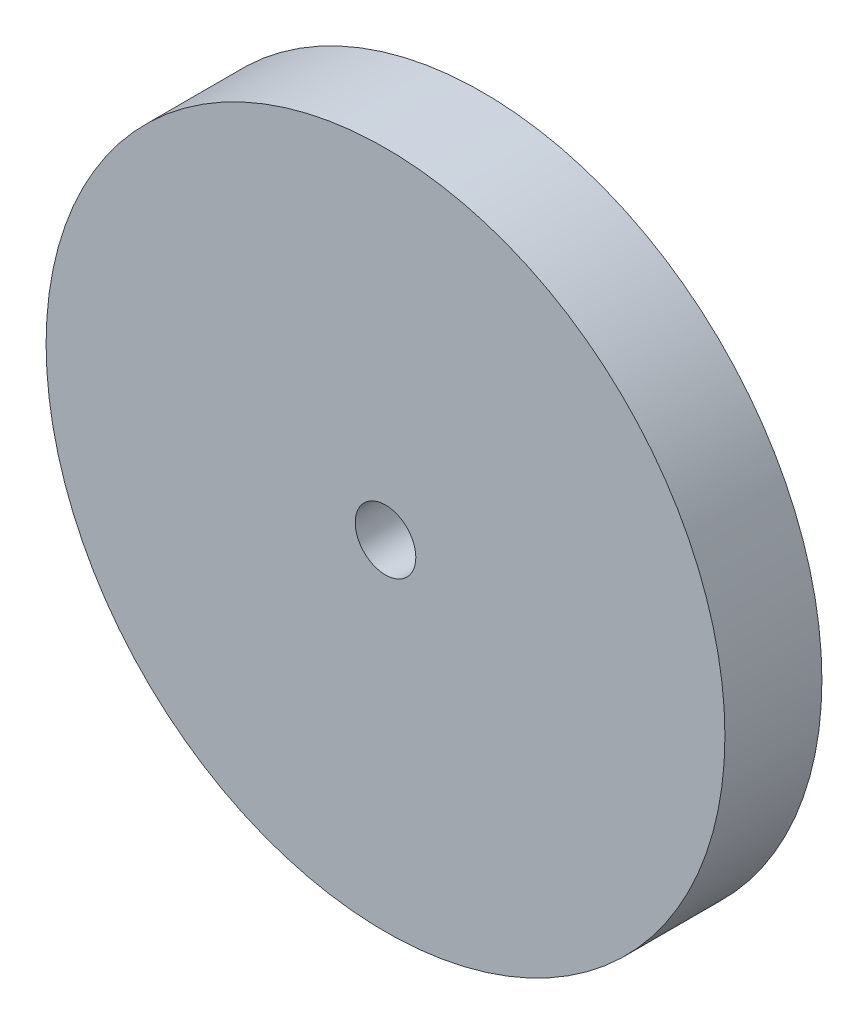
ISO-10303-21;
HEADER;
FILE_DESCRIPTION(('STEP AP214'),'2;1');
FILE_NAME('part.step','',(''),(''),'','','');
FILE_SCHEMA(('AUTOMOTIVE_DESIGN { 1 0 10303 214 1 1 1 1 }'));
ENDSEC;
DATA;
#1=APPLICATION_CONTEXT('core data for automotive mechanical design processes');
#2=APPLICATION_PROTOCOL_DEFINITION('international standard','automotive_design',2000,#1);
#3=PRODUCT_CONTEXT('',#1,'mechanical');
#4=PRODUCT('Part','Part','',(#3));
#5=PRODUCT_RELATED_PRODUCT_CATEGORY('part','',(#4));
#6=PRODUCT_DEFINITION_FORMATION('','',#4);
#7=PRODUCT_DEFINITION_CONTEXT('part definition',#1,'design');
#8=PRODUCT_DEFINITION('design','',#6,#7);
#9=PRODUCT_DEFINITION_SHAPE('','',#8);
#10=(LENGTH_UNIT() NAMED_UNIT(*) SI_UNIT(.MILLI.,.METRE.));
#11=(NAMED_UNIT(*) PLANE_ANGLE_UNIT() SI_UNIT($,.RADIAN.));
#12=(NAMED_UNIT(*) SI_UNIT($,.STERADIAN.) SOLID_ANGLE_UNIT());
#13=UNCERTAINTY_MEASURE_WITH_UNIT(LENGTH_MEASURE(1.E-05),#10,'distance_accuracy_value','');
#14=(GEOMETRIC_REPRESENTATION_CONTEXT(3) GLOBAL_UNCERTAINTY_ASSIGNED_CONTEXT((#13)) GLOBAL_UNIT_ASSIGNED_CONTEXT((#10,
#11,#12)) REPRESENTATION_CONTEXT('',''));
#15=CARTESIAN_POINT('',(0.,0.,0.));
#16=DIRECTION('',(0.,0.,1.));
#17=DIRECTION('',(1.,0.,0.));
#18=AXIS2_PLACEMENT_3D('',#15,#16,#17);
#19=CARTESIAN_POINT('',(0.,0.,40.));
#20=DIRECTION('',(0.,0.,1.));
#21=DIRECTION('',(1.,0.,0.));
#22=AXIS2_PLACEMENT_3D('',#19,#20,#21);
#23=PLANE('',#22);
#24=CARTESIAN_POINT('',(0.,0.,40.));
#25=DIRECTION('',(0.,0.,1.));
#26=DIRECTION('',(1.,0.,0.));
#27=AXIS2_PLACEMENT_3D('',#24,#25,#26);
#28=CIRCLE('',#27,140.);
#29=CARTESIAN_POINT('',(140.,0.,40.));
#30=VERTEX_POINT('',#29);
#31=EDGE_CURVE('E10',#30,#30,#28,.T.);
#32=ORIENTED_EDGE('',*,*,#31,.T.);
#33=EDGE_LOOP('',(#32));
#34=FACE_BOUND('',#33,.T.);
#35=CARTESIAN_POINT('',(0.,0.,40.));
#36=DIRECTION('',(0.,0.,1.));
#37=DIRECTION('',(1.,0.,0.));
#38=AXIS2_PLACEMENT_3D('',#35,#36,#37);
#39=CIRCLE('',#38,12.5);
#40=CARTESIAN_POINT('',(12.5,0.,40.));
#41=VERTEX_POINT('',#40);
#42=EDGE_CURVE('E56',#41,#41,#39,.T.);
#43=ORIENTED_EDGE('',*,*,#42,.F.);
#44=EDGE_LOOP('',(#43));
#45=FACE_BOUND('',#44,.T.);
#46=ADVANCED_FACE('F43',(#34,#45),#23,.T.);
#47=CARTESIAN_POINT('',(0.,0.,0.));
#48=DIRECTION('',(0.,0.,1.));
#49=DIRECTION('',(1.,0.,0.));
#50=AXIS2_PLACEMENT_3D('',#47,#48,#49);
#51=PLANE('',#50);
#52=CARTESIAN_POINT('',(0.,0.,0.));
#53=DIRECTION('',(0.,0.,1.));
#54=DIRECTION('',(1.,0.,0.));
#55=AXIS2_PLACEMENT_3D('',#52,#53,#54);
#56=CIRCLE('',#55,140.);
#57=CARTESIAN_POINT('',(140.,0.,0.));
#58=VERTEX_POINT('',#57);
#59=EDGE_CURVE('E47',#58,#58,#56,.T.);
#60=ORIENTED_EDGE('',*,*,#59,.F.);
#61=EDGE_LOOP('',(#60));
#62=FACE_BOUND('',#61,.T.);
#63=CARTESIAN_POINT('',(0.,0.,0.));
#64=DIRECTION('',(0.,0.,1.));
#65=DIRECTION('',(1.,0.,0.));
#66=AXIS2_PLACEMENT_3D('',#63,#64,#65);
#67=CIRCLE('',#66,12.5);
#68=CARTESIAN_POINT('',(12.5,0.,0.));
#69=VERTEX_POINT('',#68);
#70=EDGE_CURVE('E58',#69,#69,#67,.T.);
#71=ORIENTED_EDGE('',*,*,#70,.T.);
#72=EDGE_LOOP('',(#71));
#73=FACE_BOUND('',#72,.T.);
#74=ADVANCED_FACE('F70',(#62,#73),#51,.F.);
#75=CARTESIAN_POINT('',(0.,0.,40.));
#76=DIRECTION('',(0.,0.,-1.));
#77=DIRECTION('',(-1.,0.,0.));
#78=AXIS2_PLACEMENT_3D('',#75,#76,#77);
#79=CYLINDRICAL_SURFACE('',#78,140.);
#80=ORIENTED_EDGE('',*,*,#31,.F.);
#81=EDGE_LOOP('',(#80));
#82=FACE_BOUND('',#81,.T.);
#83=ORIENTED_EDGE('',*,*,#59,.T.);
#84=EDGE_LOOP('',(#83));
#85=FACE_BOUND('',#84,.T.);
#86=ADVANCED_FACE('F45',(#82,#85),#79,.T.);
#87=CARTESIAN_POINT('',(0.,0.,40.));
#88=DIRECTION('',(0.,0.,-1.));
#89=DIRECTION('',(-1.,0.,0.));
#90=AXIS2_PLACEMENT_3D('',#87,#88,#89);
#91=CYLINDRICAL_SURFACE('',#90,12.5);
#92=ORIENTED_EDGE('',*,*,#42,.T.);
#93=EDGE_LOOP('',(#92));
#94=FACE_BOUND('',#93,.T.);
#95=ORIENTED_EDGE('',*,*,#70,.F.);
#96=EDGE_LOOP('',(#95));
#97=FACE_BOUND('',#96,.T.);
#98=ADVANCED_FACE('F66',(#94,#97),#91,.F.);
#99=CLOSED_SHELL('',(#46,#74,#86,#98));
#100=MANIFOLD_SOLID_BREP('B2',#99);
#101=ADVANCED_BREP_SHAPE_REPRESENTATION('',(#18,#100),#14);
#102=SHAPE_DEFINITION_REPRESENTATION(#9,#101);
ENDSEC;
END-ISO-10303-21;
